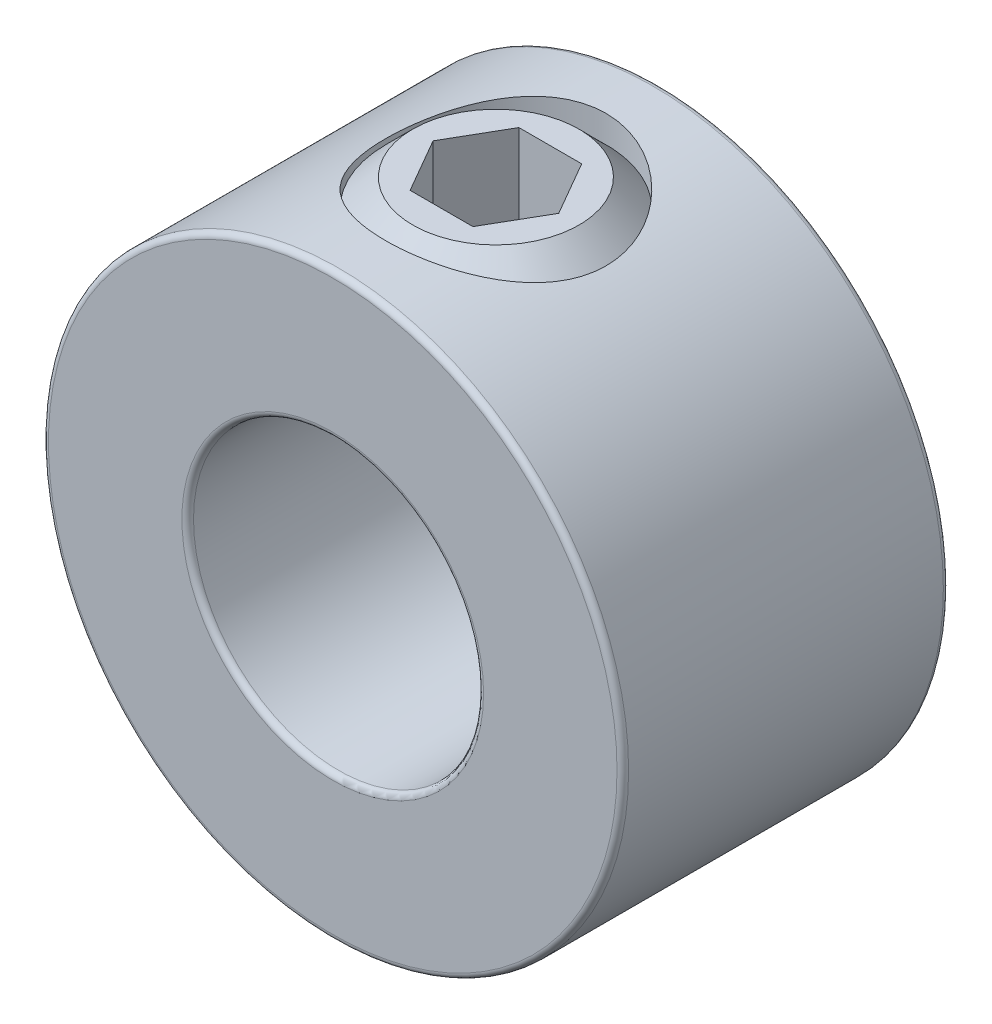
ISO-10303-21;
HEADER;
FILE_DESCRIPTION(('STEP AP214'),'2;1');
FILE_NAME('part.step','',(''),(''),'','','');
FILE_SCHEMA(('AUTOMOTIVE_DESIGN { 1 0 10303 214 1 1 1 1 }'));
ENDSEC;
DATA;
#1=APPLICATION_CONTEXT('core data for automotive mechanical design processes');
#2=APPLICATION_PROTOCOL_DEFINITION('international standard','automotive_design',2000,#1);
#3=PRODUCT_CONTEXT('',#1,'mechanical');
#4=PRODUCT('Part','Part','',(#3));
#5=PRODUCT_RELATED_PRODUCT_CATEGORY('part','',(#4));
#6=PRODUCT_DEFINITION_FORMATION('','',#4);
#7=PRODUCT_DEFINITION_CONTEXT('part definition',#1,'design');
#8=PRODUCT_DEFINITION('design','',#6,#7);
#9=PRODUCT_DEFINITION_SHAPE('','',#8);
#10=(LENGTH_UNIT() NAMED_UNIT(*) SI_UNIT(.MILLI.,.METRE.));
#11=(NAMED_UNIT(*) PLANE_ANGLE_UNIT() SI_UNIT($,.RADIAN.));
#12=(NAMED_UNIT(*) SI_UNIT($,.STERADIAN.) SOLID_ANGLE_UNIT());
#13=UNCERTAINTY_MEASURE_WITH_UNIT(LENGTH_MEASURE(1.E-05),#10,'distance_accuracy_value','');
#14=(GEOMETRIC_REPRESENTATION_CONTEXT(3) GLOBAL_UNCERTAINTY_ASSIGNED_CONTEXT((#13)) GLOBAL_UNIT_ASSIGNED_CONTEXT((#10,
#11,#12)) REPRESENTATION_CONTEXT('',''));
#15=CARTESIAN_POINT('',(0.,0.,0.));
#16=DIRECTION('',(0.,0.,1.));
#17=DIRECTION('',(1.,0.,0.));
#18=AXIS2_PLACEMENT_3D('',#15,#16,#17);
#19=CARTESIAN_POINT('',(0.,6.35,0.));
#20=DIRECTION('',(0.,1.,0.));
#21=DIRECTION('',(-1.,0.,0.));
#22=AXIS2_PLACEMENT_3D('',#19,#20,#21);
#23=PLANE('',#22);
#24=CARTESIAN_POINT('',(0.,6.35,0.));
#25=DIRECTION('',(0.,1.,0.));
#26=DIRECTION('',(-1.,0.,0.));
#27=AXIS2_PLACEMENT_3D('',#24,#25,#26);
#28=CIRCLE('',#27,1.81975161629017);
#29=CARTESIAN_POINT('',(-1.81975161629017,6.35,0.));
#30=VERTEX_POINT('',#29);
#31=EDGE_CURVE('E12',#30,#30,#28,.T.);
#32=ORIENTED_EDGE('',*,*,#31,.T.);
#33=EDGE_LOOP('',(#32));
#34=FACE_BOUND('',#33,.T.);
#35=DIRECTION('',(1.,0.,0.));
#36=VECTOR('',#35,1.);
#37=CARTESIAN_POINT('',(-0.687407664253899,6.34999999999999,-1.190625));
#38=LINE('',#37,#36);
#39=CARTESIAN_POINT('',(-0.687407664253899,6.34999999999999,-1.190625));
#40=VERTEX_POINT('',#39);
#41=CARTESIAN_POINT('',(0.687407664253899,6.35,-1.190625));
#42=VERTEX_POINT('',#41);
#43=EDGE_CURVE('E110',#40,#42,#38,.T.);
#44=ORIENTED_EDGE('',*,*,#43,.T.);
#45=DIRECTION('',(0.5,0.,0.866025403784439));
#46=VECTOR('',#45,1.);
#47=CARTESIAN_POINT('',(0.687407664253899,6.34999999999999,-1.190625));
#48=LINE('',#47,#46);
#49=CARTESIAN_POINT('',(1.3748153285078,6.34999999999999,0.));
#50=VERTEX_POINT('',#49);
#51=EDGE_CURVE('E56',#42,#50,#48,.T.);
#52=ORIENTED_EDGE('',*,*,#51,.T.);
#53=DIRECTION('',(-0.5,0.,0.866025403784439));
#54=VECTOR('',#53,1.);
#55=CARTESIAN_POINT('',(1.3748153285078,6.34999999999999,0.));
#56=LINE('',#55,#54);
#57=CARTESIAN_POINT('',(0.687407664253899,6.34999999999999,1.190625));
#58=VERTEX_POINT('',#57);
#59=EDGE_CURVE('E114',#50,#58,#56,.T.);
#60=ORIENTED_EDGE('',*,*,#59,.T.);
#61=DIRECTION('',(-1.,0.,0.));
#62=VECTOR('',#61,1.);
#63=CARTESIAN_POINT('',(0.687407664253899,6.34999999999999,1.190625));
#64=LINE('',#63,#62);
#65=CARTESIAN_POINT('',(-0.687407664253899,6.34999999999999,1.190625));
#66=VERTEX_POINT('',#65);
#67=EDGE_CURVE('E177',#58,#66,#64,.T.);
#68=ORIENTED_EDGE('',*,*,#67,.T.);
#69=DIRECTION('',(-0.5,0.,-0.866025403784439));
#70=VECTOR('',#69,1.);
#71=CARTESIAN_POINT('',(-0.687407664253899,6.34999999999999,1.190625));
#72=LINE('',#71,#70);
#73=CARTESIAN_POINT('',(-1.3748153285078,6.34999999999999,0.));
#74=VERTEX_POINT('',#73);
#75=EDGE_CURVE('E162',#66,#74,#72,.T.);
#76=ORIENTED_EDGE('',*,*,#75,.T.);
#77=DIRECTION('',(0.5,0.,-0.866025403784439));
#78=VECTOR('',#77,1.);
#79=CARTESIAN_POINT('',(-1.3748153285078,6.34999999999999,0.));
#80=LINE('',#79,#78);
#81=EDGE_CURVE('E158',#74,#40,#80,.T.);
#82=ORIENTED_EDGE('',*,*,#81,.T.);
#83=EDGE_LOOP('',(#44,#52,#60,#68,#76,#82));
#84=FACE_BOUND('',#83,.T.);
#85=ADVANCED_FACE('F42',(#34,#84),#23,.T.);
#86=CARTESIAN_POINT('',(0.,6.35,0.));
#87=DIRECTION('',(0.,-1.,0.));
#88=DIRECTION('',(1.,0.,0.));
#89=AXIS2_PLACEMENT_3D('',#86,#87,#88);
#90=CONICAL_SURFACE('',#89,1.81975161629017,0.785398163397449);
#91=CARTESIAN_POINT('',(0.,5.75675161629017,0.));
#92=DIRECTION('',(0.,1.,0.));
#93=DIRECTION('',(-1.,0.,0.));
#94=AXIS2_PLACEMENT_3D('',#91,#92,#93);
#95=CIRCLE('',#94,2.413);
#96=CARTESIAN_POINT('',(-2.413,5.75675161629017,0.));
#97=VERTEX_POINT('',#96);
#98=EDGE_CURVE('E49',#97,#97,#95,.T.);
#99=ORIENTED_EDGE('',*,*,#98,.T.);
#100=EDGE_LOOP('',(#99));
#101=FACE_BOUND('',#100,.T.);
#102=ORIENTED_EDGE('',*,*,#31,.F.);
#103=EDGE_LOOP('',(#102));
#104=FACE_BOUND('',#103,.T.);
#105=ADVANCED_FACE('F132',(#101,#104),#90,.T.);
#106=CARTESIAN_POINT('',(0.,3.175,0.));
#107=DIRECTION('',(0.,1.,0.));
#108=DIRECTION('',(-1.,0.,0.));
#109=AXIS2_PLACEMENT_3D('',#106,#107,#108);
#110=CYLINDRICAL_SURFACE('',#109,2.413);
#111=CARTESIAN_POINT('',(0.,3.76824838370983,0.));
#112=DIRECTION('',(0.,1.,0.));
#113=DIRECTION('',(-1.,0.,0.));
#114=AXIS2_PLACEMENT_3D('',#111,#112,#113);
#115=CIRCLE('',#114,2.413);
#116=CARTESIAN_POINT('',(-2.413,3.76824838370983,0.));
#117=VERTEX_POINT('',#116);
#118=EDGE_CURVE('E127',#117,#117,#115,.T.);
#119=ORIENTED_EDGE('',*,*,#118,.T.);
#120=EDGE_LOOP('',(#119));
#121=FACE_BOUND('',#120,.T.);
#122=ORIENTED_EDGE('',*,*,#98,.F.);
#123=EDGE_LOOP('',(#122));
#124=FACE_BOUND('',#123,.T.);
#125=ADVANCED_FACE('F135',(#121,#124),#110,.T.);
#126=CARTESIAN_POINT('',(0.,3.76824838370983,0.));
#127=DIRECTION('',(0.,1.,0.));
#128=DIRECTION('',(-1.,0.,0.));
#129=AXIS2_PLACEMENT_3D('',#126,#127,#128);
#130=CONICAL_SURFACE('',#129,2.413,0.785398163397448);
#131=CARTESIAN_POINT('',(0.,3.175,0.));
#132=DIRECTION('',(0.,1.,0.));
#133=DIRECTION('',(-1.,0.,0.));
#134=AXIS2_PLACEMENT_3D('',#131,#132,#133);
#135=CIRCLE('',#134,1.81975161629017);
#136=CARTESIAN_POINT('',(-1.81975161629017,3.175,0.));
#137=VERTEX_POINT('',#136);
#138=EDGE_CURVE('E119',#137,#137,#135,.T.);
#139=ORIENTED_EDGE('',*,*,#138,.T.);
#140=EDGE_LOOP('',(#139));
#141=FACE_BOUND('',#140,.T.);
#142=ORIENTED_EDGE('',*,*,#118,.F.);
#143=EDGE_LOOP('',(#142));
#144=FACE_BOUND('',#143,.T.);
#145=ADVANCED_FACE('F137',(#141,#144),#130,.T.);
#146=CARTESIAN_POINT('',(-1.81975161629017,3.175,0.));
#147=DIRECTION('',(0.,-1.,0.));
#148=DIRECTION('',(1.,0.,0.));
#149=AXIS2_PLACEMENT_3D('',#146,#147,#148);
#150=PLANE('',#149);
#151=CARTESIAN_POINT('',(0.,3.175,0.));
#152=DIRECTION('',(0.,1.,0.));
#153=DIRECTION('',(-1.,0.,0.));
#154=AXIS2_PLACEMENT_3D('',#151,#152,#153);
#155=CIRCLE('',#154,0.711898060451796);
#156=CARTESIAN_POINT('',(-0.711898060451796,3.175,0.));
#157=VERTEX_POINT('',#156);
#158=EDGE_CURVE('E115',#157,#157,#155,.T.);
#159=ORIENTED_EDGE('',*,*,#158,.T.);
#160=EDGE_LOOP('',(#159));
#161=FACE_BOUND('',#160,.T.);
#162=ORIENTED_EDGE('',*,*,#138,.F.);
#163=EDGE_LOOP('',(#162));
#164=FACE_BOUND('',#163,.T.);
#165=ADVANCED_FACE('F144',(#161,#164),#150,.T.);
#166=CARTESIAN_POINT('',(0.,3.175,0.));
#167=DIRECTION('',(0.,-1.,0.));
#168=DIRECTION('',(1.,0.,0.));
#169=AXIS2_PLACEMENT_3D('',#166,#167,#168);
#170=CONICAL_SURFACE('',#169,0.711898060451796,0.785398163397448);
#171=CARTESIAN_POINT('',(0.,3.8868980604518,0.));
#172=VERTEX_POINT('',#171);
#173=VERTEX_LOOP('',#172);
#174=FACE_BOUND('',#173,.T.);
#175=ORIENTED_EDGE('',*,*,#158,.F.);
#176=EDGE_LOOP('',(#175));
#177=FACE_BOUND('',#176,.T.);
#178=ADVANCED_FACE('F211',(#174,#177),#170,.F.);
#179=CARTESIAN_POINT('',(0.687407664253899,3.96874999999999,-1.190625));
#180=DIRECTION('',(-0.866025403784439,0.,0.5));
#181=DIRECTION('',(0.5,0.,0.866025403784438));
#182=AXIS2_PLACEMENT_3D('',#179,#180,#181);
#183=PLANE('',#182);
#184=ORIENTED_EDGE('',*,*,#51,.F.);
#185=DIRECTION('',(0.,1.,0.));
#186=VECTOR('',#185,1.);
#187=CARTESIAN_POINT('',(0.687407664253899,3.96874999999999,-1.190625));
#188=LINE('',#187,#186);
#189=CARTESIAN_POINT('',(0.687407664253899,3.96874999999999,-1.190625));
#190=VERTEX_POINT('',#189);
#191=EDGE_CURVE('E109',#190,#42,#188,.T.);
#192=ORIENTED_EDGE('',*,*,#191,.F.);
#193=DIRECTION('',(0.5,0.,0.866025403784439));
#194=VECTOR('',#193,1.);
#195=CARTESIAN_POINT('',(0.687407664253899,3.96874999999999,-1.190625));
#196=LINE('',#195,#194);
#197=CARTESIAN_POINT('',(1.3748153285078,3.96874999999999,0.));
#198=VERTEX_POINT('',#197);
#199=EDGE_CURVE('E100',#190,#198,#196,.T.);
#200=ORIENTED_EDGE('',*,*,#199,.T.);
#201=DIRECTION('',(0.,1.,0.));
#202=VECTOR('',#201,1.);
#203=CARTESIAN_POINT('',(1.3748153285078,3.96874999999999,0.));
#204=LINE('',#203,#202);
#205=EDGE_CURVE('E108',#198,#50,#204,.T.);
#206=ORIENTED_EDGE('',*,*,#205,.T.);
#207=EDGE_LOOP('',(#184,#192,#200,#206));
#208=FACE_BOUND('',#207,.T.);
#209=ADVANCED_FACE('F107',(#208),#183,.T.);
#210=CARTESIAN_POINT('',(1.3748153285078,3.96874999999999,0.));
#211=DIRECTION('',(-0.866025403784439,0.,-0.5));
#212=DIRECTION('',(-0.5,0.,0.866025403784439));
#213=AXIS2_PLACEMENT_3D('',#210,#211,#212);
#214=PLANE('',#213);
#215=ORIENTED_EDGE('',*,*,#59,.F.);
#216=ORIENTED_EDGE('',*,*,#205,.F.);
#217=DIRECTION('',(-0.5,0.,0.866025403784439));
#218=VECTOR('',#217,1.);
#219=CARTESIAN_POINT('',(1.3748153285078,3.96874999999999,0.));
#220=LINE('',#219,#218);
#221=CARTESIAN_POINT('',(0.687407664253899,3.96874999999999,1.190625));
#222=VERTEX_POINT('',#221);
#223=EDGE_CURVE('E96',#198,#222,#220,.T.);
#224=ORIENTED_EDGE('',*,*,#223,.T.);
#225=DIRECTION('',(0.,1.,0.));
#226=VECTOR('',#225,1.);
#227=CARTESIAN_POINT('',(0.687407664253899,3.96874999999999,1.190625));
#228=LINE('',#227,#226);
#229=EDGE_CURVE('E116',#222,#58,#228,.T.);
#230=ORIENTED_EDGE('',*,*,#229,.T.);
#231=EDGE_LOOP('',(#215,#216,#224,#230));
#232=FACE_BOUND('',#231,.T.);
#233=ADVANCED_FACE('F112',(#232),#214,.T.);
#234=CARTESIAN_POINT('',(0.687407664253899,3.96874999999999,1.190625));
#235=DIRECTION('',(0.,0.,-1.));
#236=DIRECTION('',(-1.,0.,0.));
#237=AXIS2_PLACEMENT_3D('',#234,#235,#236);
#238=PLANE('',#237);
#239=ORIENTED_EDGE('',*,*,#67,.F.);
#240=ORIENTED_EDGE('',*,*,#229,.F.);
#241=DIRECTION('',(-1.,0.,0.));
#242=VECTOR('',#241,1.);
#243=CARTESIAN_POINT('',(0.687407664253899,3.96874999999999,1.190625));
#244=LINE('',#243,#242);
#245=CARTESIAN_POINT('',(-0.687407664253899,3.96874999999999,1.190625));
#246=VERTEX_POINT('',#245);
#247=EDGE_CURVE('E102',#222,#246,#244,.T.);
#248=ORIENTED_EDGE('',*,*,#247,.T.);
#249=DIRECTION('',(0.,1.,0.));
#250=VECTOR('',#249,1.);
#251=CARTESIAN_POINT('',(-0.687407664253899,3.96874999999999,1.190625));
#252=LINE('',#251,#250);
#253=EDGE_CURVE('E121',#246,#66,#252,.T.);
#254=ORIENTED_EDGE('',*,*,#253,.T.);
#255=EDGE_LOOP('',(#239,#240,#248,#254));
#256=FACE_BOUND('',#255,.T.);
#257=ADVANCED_FACE('F175',(#256),#238,.T.);
#258=CARTESIAN_POINT('',(-0.687407664253899,3.96874999999999,1.190625));
#259=DIRECTION('',(0.866025403784439,0.,-0.5));
#260=DIRECTION('',(-0.5,0.,-0.866025403784438));
#261=AXIS2_PLACEMENT_3D('',#258,#259,#260);
#262=PLANE('',#261);
#263=ORIENTED_EDGE('',*,*,#75,.F.);
#264=ORIENTED_EDGE('',*,*,#253,.F.);
#265=DIRECTION('',(-0.5,0.,-0.866025403784439));
#266=VECTOR('',#265,1.);
#267=CARTESIAN_POINT('',(-0.687407664253899,3.96874999999999,1.190625));
#268=LINE('',#267,#266);
#269=CARTESIAN_POINT('',(-1.3748153285078,3.96874999999999,0.));
#270=VERTEX_POINT('',#269);
#271=EDGE_CURVE('E188',#246,#270,#268,.T.);
#272=ORIENTED_EDGE('',*,*,#271,.T.);
#273=DIRECTION('',(0.,1.,0.));
#274=VECTOR('',#273,1.);
#275=CARTESIAN_POINT('',(-1.3748153285078,3.96874999999999,0.));
#276=LINE('',#275,#274);
#277=EDGE_CURVE('E170',#270,#74,#276,.T.);
#278=ORIENTED_EDGE('',*,*,#277,.T.);
#279=EDGE_LOOP('',(#263,#264,#272,#278));
#280=FACE_BOUND('',#279,.T.);
#281=ADVANCED_FACE('F179',(#280),#262,.T.);
#282=CARTESIAN_POINT('',(-1.3748153285078,3.96874999999999,0.));
#283=DIRECTION('',(0.866025403784439,0.,0.5));
#284=DIRECTION('',(0.5,0.,-0.866025403784439));
#285=AXIS2_PLACEMENT_3D('',#282,#283,#284);
#286=PLANE('',#285);
#287=ORIENTED_EDGE('',*,*,#81,.F.);
#288=ORIENTED_EDGE('',*,*,#277,.F.);
#289=DIRECTION('',(0.5,0.,-0.866025403784439));
#290=VECTOR('',#289,1.);
#291=CARTESIAN_POINT('',(-1.3748153285078,3.96874999999999,0.));
#292=LINE('',#291,#290);
#293=CARTESIAN_POINT('',(-0.687407664253899,3.96874999999999,-1.190625));
#294=VERTEX_POINT('',#293);
#295=EDGE_CURVE('E186',#270,#294,#292,.T.);
#296=ORIENTED_EDGE('',*,*,#295,.T.);
#297=DIRECTION('',(0.,1.,0.));
#298=VECTOR('',#297,1.);
#299=CARTESIAN_POINT('',(-0.687407664253899,3.96874999999999,-1.190625));
#300=LINE('',#299,#298);
#301=EDGE_CURVE('E167',#294,#40,#300,.T.);
#302=ORIENTED_EDGE('',*,*,#301,.T.);
#303=EDGE_LOOP('',(#287,#288,#296,#302));
#304=FACE_BOUND('',#303,.T.);
#305=ADVANCED_FACE('F192',(#304),#286,.T.);
#306=CARTESIAN_POINT('',(-0.687407664253899,3.96874999999999,-1.190625));
#307=DIRECTION('',(0.,0.,1.));
#308=DIRECTION('',(1.,0.,0.));
#309=AXIS2_PLACEMENT_3D('',#306,#307,#308);
#310=PLANE('',#309);
#311=ORIENTED_EDGE('',*,*,#43,.F.);
#312=ORIENTED_EDGE('',*,*,#301,.F.);
#313=DIRECTION('',(1.,0.,0.));
#314=VECTOR('',#313,1.);
#315=CARTESIAN_POINT('',(-0.687407664253899,3.96874999999999,-1.190625));
#316=LINE('',#315,#314);
#317=EDGE_CURVE('E168',#294,#190,#316,.T.);
#318=ORIENTED_EDGE('',*,*,#317,.T.);
#319=ORIENTED_EDGE('',*,*,#191,.T.);
#320=EDGE_LOOP('',(#311,#312,#318,#319));
#321=FACE_BOUND('',#320,.T.);
#322=ADVANCED_FACE('F193',(#321),#310,.T.);
#323=CARTESIAN_POINT('',(1.3748153285078,3.96874999999999,0.));
#324=DIRECTION('',(0.,-1.,0.));
#325=DIRECTION('',(0.,0.,-1.));
#326=AXIS2_PLACEMENT_3D('',#323,#324,#325);
#327=PLANE('',#326);
#328=ORIENTED_EDGE('',*,*,#199,.F.);
#329=ORIENTED_EDGE('',*,*,#317,.F.);
#330=ORIENTED_EDGE('',*,*,#295,.F.);
#331=ORIENTED_EDGE('',*,*,#271,.F.);
#332=ORIENTED_EDGE('',*,*,#247,.F.);
#333=ORIENTED_EDGE('',*,*,#223,.F.);
#334=EDGE_LOOP('',(#328,#329,#330,#331,#332,#333));
#335=FACE_BOUND('',#334,.T.);
#336=ADVANCED_FACE('F98',(#335),#327,.F.);
#337=CLOSED_SHELL('',(#85,#105,#125,#145,#165,#178,#209,#233,#257,#281,#305,#322,#336));
#338=MANIFOLD_SOLID_BREP('B2',#337);
#339=CARTESIAN_POINT('',(0.,0.,3.571875));
#340=DIRECTION('',(0.,0.,1.));
#341=DIRECTION('',(1.,0.,0.));
#342=AXIS2_PLACEMENT_3D('',#339,#340,#341);
#343=PLANE('',#342);
#344=CARTESIAN_POINT('',(0.,0.,3.571875));
#345=DIRECTION('',(0.,0.,1.));
#346=DIRECTION('',(1.,0.,0.));
#347=AXIS2_PLACEMENT_3D('',#344,#345,#346);
#348=CIRCLE('',#347,3.302);
#349=CARTESIAN_POINT('',(3.302,0.,3.571875));
#350=VERTEX_POINT('',#349);
#351=EDGE_CURVE('E307',#350,#350,#348,.F.);
#352=ORIENTED_EDGE('',*,*,#351,.T.);
#353=EDGE_LOOP('',(#352));
#354=FACE_BOUND('',#353,.T.);
#355=CARTESIAN_POINT('',(0.,0.,3.571875));
#356=DIRECTION('',(0.,0.,1.));
#357=DIRECTION('',(1.,0.,0.));
#358=AXIS2_PLACEMENT_3D('',#355,#356,#357);
#359=CIRCLE('',#358,6.223);
#360=CARTESIAN_POINT('',(6.223,0.,3.571875));
#361=VERTEX_POINT('',#360);
#362=EDGE_CURVE('E311',#361,#361,#359,.T.);
#363=ORIENTED_EDGE('',*,*,#362,.T.);
#364=EDGE_LOOP('',(#363));
#365=FACE_BOUND('',#364,.T.);
#366=ADVANCED_FACE('F296',(#354,#365),#343,.T.);
#367=CARTESIAN_POINT('',(0.,0.,-3.571875));
#368=DIRECTION('',(0.,0.,1.));
#369=DIRECTION('',(1.,0.,0.));
#370=AXIS2_PLACEMENT_3D('',#367,#368,#369);
#371=PLANE('',#370);
#372=CARTESIAN_POINT('',(0.,0.,-3.571875));
#373=DIRECTION('',(0.,0.,1.));
#374=DIRECTION('',(1.,0.,0.));
#375=AXIS2_PLACEMENT_3D('',#372,#373,#374);
#376=CIRCLE('',#375,3.302);
#377=CARTESIAN_POINT('',(3.302,0.,-3.571875));
#378=VERTEX_POINT('',#377);
#379=EDGE_CURVE('E322',#378,#378,#376,.T.);
#380=ORIENTED_EDGE('',*,*,#379,.T.);
#381=EDGE_LOOP('',(#380));
#382=FACE_BOUND('',#381,.T.);
#383=CARTESIAN_POINT('',(0.,0.,-3.571875));
#384=DIRECTION('',(0.,0.,1.));
#385=DIRECTION('',(1.,0.,0.));
#386=AXIS2_PLACEMENT_3D('',#383,#384,#385);
#387=CIRCLE('',#386,6.223);
#388=CARTESIAN_POINT('',(6.223,0.,-3.571875));
#389=VERTEX_POINT('',#388);
#390=EDGE_CURVE('E325',#389,#389,#387,.F.);
#391=ORIENTED_EDGE('',*,*,#390,.T.);
#392=EDGE_LOOP('',(#391));
#393=FACE_BOUND('',#392,.T.);
#394=ADVANCED_FACE('F361',(#382,#393),#371,.F.);
#395=CARTESIAN_POINT('',(0.,0.,3.571875));
#396=DIRECTION('',(0.,0.,-1.));
#397=DIRECTION('',(-1.,0.,0.));
#398=AXIS2_PLACEMENT_3D('',#395,#396,#397);
#399=CYLINDRICAL_SURFACE('',#398,6.35);
#400=CARTESIAN_POINT('',(0.,0.,-3.444875));
#401=DIRECTION('',(0.,0.,1.));
#402=DIRECTION('',(1.,0.,0.));
#403=AXIS2_PLACEMENT_3D('',#400,#401,#402);
#404=CIRCLE('',#403,6.35);
#405=CARTESIAN_POINT('',(6.35,0.,-3.444875));
#406=VERTEX_POINT('',#405);
#407=EDGE_CURVE('E41',#406,#406,#404,.T.);
#408=ORIENTED_EDGE('',*,*,#407,.T.);
#409=EDGE_LOOP('',(#408));
#410=FACE_BOUND('',#409,.T.);
#411=CARTESIAN_POINT('',(0.,0.,3.444875));
#412=DIRECTION('',(0.,0.,1.));
#413=DIRECTION('',(1.,0.,0.));
#414=AXIS2_PLACEMENT_3D('',#411,#412,#413);
#415=CIRCLE('',#414,6.35);
#416=CARTESIAN_POINT('',(6.35,0.,3.444875));
#417=VERTEX_POINT('',#416);
#418=EDGE_CURVE('E303',#417,#417,#415,.F.);
#419=ORIENTED_EDGE('',*,*,#418,.T.);
#420=EDGE_LOOP('',(#419));
#421=FACE_BOUND('',#420,.T.);
#422=CARTESIAN_POINT('',(0.,6.35,-2.413));
#423=CARTESIAN_POINT('',(0.130555931467962,6.35000398969011,-2.41300527534602));
#424=CARTESIAN_POINT('',(0.261076241377739,6.34593890816647,-2.4023714543113));
#425=CARTESIAN_POINT('',(0.518209446534913,6.33012963929965,-2.36029479676423));
#426=CARTESIAN_POINT('',(0.644823015088655,6.31838678300935,-2.32885556715778));
#427=CARTESIAN_POINT('',(0.890396734122701,6.28848040494,-2.24644511602075));
#428=CARTESIAN_POINT('',(1.00937135935963,6.27032947705095,-2.19551218938446));
#429=CARTESIAN_POINT('',(1.23707694907279,6.22940932060409,-2.07575764561934));
#430=CARTESIAN_POINT('',(1.34580507871092,6.20663881943741,-2.00693109764769));
#431=CARTESIAN_POINT('',(1.5546544090621,6.15771932779737,-1.85022277092613));
#432=CARTESIAN_POINT('',(1.65427192875035,6.13147296383124,-1.76170041624995));
#433=CARTESIAN_POINT('',(1.83765571561736,6.07903240405007,-1.56947315042905));
#434=CARTESIAN_POINT('',(1.92141693988139,6.05283822744466,-1.46576342765122));
#435=CARTESIAN_POINT('',(2.07395660623911,6.00232668170519,-1.24113386470124));
#436=CARTESIAN_POINT('',(2.14201618015845,5.97812365120729,-1.11969756154783));
#437=CARTESIAN_POINT('',(2.25652093858858,5.93585432476053,-0.866038380432351));
#438=CARTESIAN_POINT('',(2.30297502037546,5.91778550353544,-0.733819969020803));
#439=CARTESIAN_POINT('',(2.37094947712185,5.89087364983883,-0.46815363189803));
#440=CARTESIAN_POINT('',(2.39343294050412,5.88167580744491,-0.334989300795486));
#441=CARTESIAN_POINT('',(2.41583880524757,5.87251090464605,-0.0664845962936197));
#442=CARTESIAN_POINT('',(2.41577084821779,5.87253989940926,0.0688548224232351));
#443=CARTESIAN_POINT('',(2.39381090108878,5.88152011871453,0.328972227003014));
#444=CARTESIAN_POINT('',(2.37326609797153,5.88992057372023,0.453886522563246));
#445=CARTESIAN_POINT('',(2.31316652422954,5.91378008823147,0.698339704990829));
#446=CARTESIAN_POINT('',(2.27360881167116,5.92924024008996,0.817877756841903));
#447=CARTESIAN_POINT('',(2.17588364092748,5.96580146890692,1.0508916152852));
#448=CARTESIAN_POINT('',(2.11737290423754,5.98700531598431,1.16420661484106));
#449=CARTESIAN_POINT('',(1.98364217411328,6.03263175509447,1.37979639920587));
#450=CARTESIAN_POINT('',(1.90841630395244,6.05705547794376,1.4820672822727));
#451=CARTESIAN_POINT('',(1.73726689770536,6.10842961274997,1.68010694238863));
#452=CARTESIAN_POINT('',(1.64027173491613,6.13543795015635,1.77493688260015));
#453=CARTESIAN_POINT('',(1.43144868882472,6.18748920351012,1.94726806056401));
#454=CARTESIAN_POINT('',(1.31961840653187,6.2125318005324,2.02476649017818));
#455=CARTESIAN_POINT('',(1.08185265975391,6.25835188225341,2.16130771487283));
#456=CARTESIAN_POINT('',(0.955717417234618,6.27905339803369,2.22002994310971));
#457=CARTESIAN_POINT('',(0.694375189035109,6.31329326294077,2.31510736575226));
#458=CARTESIAN_POINT('',(0.559172376611221,6.32683488218724,2.3514727723643));
#459=CARTESIAN_POINT('',(0.291428150212525,6.3446501972992,2.39898109857718));
#460=CARTESIAN_POINT('',(0.159141645079808,6.34938771868047,2.41138775288999));
#461=CARTESIAN_POINT('',(-0.105693065348276,6.35049981057155,2.41431626348443));
#462=CARTESIAN_POINT('',(-0.238241203822052,6.34687629478166,2.40484312768025));
#463=CARTESIAN_POINT('',(-0.494323602805378,6.33197908606406,2.36523562382545));
#464=CARTESIAN_POINT('',(-0.61800684441211,6.32101461634214,2.33593589818825));
#465=CARTESIAN_POINT('',(-0.858609565436108,6.29285092848222,2.25861304376362));
#466=CARTESIAN_POINT('',(-0.975528163914414,6.27565090041604,2.21058748264173));
#467=CARTESIAN_POINT('',(-1.20317276582384,6.23607457125026,2.09563503714011));
#468=CARTESIAN_POINT('',(-1.3136121499673,6.21355984396609,2.02818967610491));
#469=CARTESIAN_POINT('',(-1.52197988578177,6.16583504517286,1.87689595883598));
#470=CARTESIAN_POINT('',(-1.61990351002366,6.14062396176678,1.79304143465584));
#471=CARTESIAN_POINT('',(-1.80656807112922,6.08841217199752,1.60543272496061));
#472=CARTESIAN_POINT('',(-1.89441393314817,6.06139435477813,1.5007904098217));
#473=CARTESIAN_POINT('',(-2.05148411432654,6.01005496187559,1.27772800811267));
#474=CARTESIAN_POINT('',(-2.12070651399853,5.98573366426972,1.15930650314625));
#475=CARTESIAN_POINT('',(-2.23870023772464,5.94261798623815,0.910922748538602));
#476=CARTESIAN_POINT('',(-2.28736466342468,5.92385264334907,0.780904332023381));
#477=CARTESIAN_POINT('',(-2.36177800946808,5.89458517077402,0.513602694331982));
#478=CARTESIAN_POINT('',(-2.38754162954713,5.8840777409413,0.376324193363579));
#479=CARTESIAN_POINT('',(-2.41408994040532,5.87323215610138,0.108127165215383));
#480=CARTESIAN_POINT('',(-2.41640623148607,5.87227054588007,-0.0226157343841075));
#481=CARTESIAN_POINT('',(-2.3999373204655,5.8790202253426,-0.282524873396556));
#482=CARTESIAN_POINT('',(-2.38115423316032,5.88673064582666,-0.41169126951125));
#483=CARTESIAN_POINT('',(-2.32422421188573,5.90943043237583,-0.660552265849344));
#484=CARTESIAN_POINT('',(-2.28672002796391,5.92417751295514,-0.780417919491674));
#485=CARTESIAN_POINT('',(-2.19398528189399,5.95914188552999,-1.01222145618602));
#486=CARTESIAN_POINT('',(-2.13875018285588,5.97936057736356,-1.12415730124382));
#487=CARTESIAN_POINT('',(-2.00869997639504,6.02433337271119,-1.34342800575803));
#488=CARTESIAN_POINT('',(-1.93299650808671,6.04927206356278,-1.4501976241717));
#489=CARTESIAN_POINT('',(-1.76551836882645,6.10025417003155,-1.65000619367226));
#490=CARTESIAN_POINT('',(-1.67373852090438,6.12629793945648,-1.74304070389426));
#491=CARTESIAN_POINT('',(-1.47055494697206,6.17831294001547,-1.91807209951937));
#492=CARTESIAN_POINT('',(-1.35833856072122,6.20419794006484,-1.99915556641372));
#493=CARTESIAN_POINT('',(-1.12096041375387,6.25144642675378,-2.14129762074769));
#494=CARTESIAN_POINT('',(-0.995797050693124,6.27280935273315,-2.20235372565052));
#495=CARTESIAN_POINT('',(-0.728778395788011,6.30955475572144,-2.30499263616226));
#496=CARTESIAN_POINT('',(-0.58638469778337,6.32454657619379,-2.3453288052365));
#497=CARTESIAN_POINT('',(-0.295976705251577,6.34476431329028,-2.39932232882264));
#498=CARTESIAN_POINT('',(-0.147965475024477,6.34999547828747,-2.41299402119021));
#499=CARTESIAN_POINT('',(0.,6.35,-2.413));
#500=B_SPLINE_CURVE_WITH_KNOTS('',3,(#422,#423,#424,#425,#426,#427,#428,#429,#430,#431,#432,
#433,#434,#435,#436,#437,#438,#439,#440,#441,#442,#443,#444,#445,#446,#447,#448,#449,#450,#451,
#452,#453,#454,#455,#456,#457,#458,#459,#460,#461,#462,#463,#464,#465,#466,#467,#468,#469,#470,
#471,#472,#473,#474,#475,#476,#477,#478,#479,#480,#481,#482,#483,#484,#485,#486,#487,#488,#489,
#490,#491,#492,#493,#494,#495,#496,#497,#498,#499),.UNSPECIFIED.,.T.,.F.,(4,2,2,2,2,2,2,2,2,2,2,
2,2,2,2,2,2,2,2,2,2,2,2,2,2,2,2,2,2,2,2,2,2,2,2,2,2,2,4),(0.,0.391121887064184,
0.782175985486185,1.17246577830223,1.56286323524963,1.96854634212709,2.37435825594016,
2.79613130529395,3.21773051175688,3.62166628723491,4.02542936468621,4.40427313209371,
4.78317553819666,5.16936515238192,5.55569075901495,5.96873424705112,6.38184461005431,
6.80167192308661,7.22130732355892,7.61812936188612,8.01486058335588,8.39585156202364,
8.77689204483065,9.16923685274999,9.56172942118012,9.9776135359701,10.3935404987953,
10.8116043631128,11.2293996833676,11.6197130905881,12.0099873800853,12.3876994067832,
12.7655081575183,13.1635000328781,13.5616203073395,13.9821012344605,14.4026342635628,
14.8461505355472,15.2894282569131),.UNSPECIFIED.);
#501=CARTESIAN_POINT('',(0.,6.35,-2.413));
#502=VERTEX_POINT('',#501);
#503=EDGE_CURVE('E328',#502,#502,#500,.T.);
#504=ORIENTED_EDGE('',*,*,#503,.T.);
#505=EDGE_LOOP('',(#504));
#506=FACE_BOUND('',#505,.T.);
#507=ADVANCED_FACE('F357',(#410,#421,#506),#399,.T.);
#508=CARTESIAN_POINT('',(0.,0.,3.571875));
#509=DIRECTION('',(0.,0.,-1.));
#510=DIRECTION('',(-1.,0.,0.));
#511=AXIS2_PLACEMENT_3D('',#508,#509,#510);
#512=CYLINDRICAL_SURFACE('',#511,3.175);
#513=CARTESIAN_POINT('',(0.,0.,-3.444875));
#514=DIRECTION('',(0.,0.,1.));
#515=DIRECTION('',(1.,0.,0.));
#516=AXIS2_PLACEMENT_3D('',#513,#514,#515);
#517=CIRCLE('',#516,3.175);
#518=CARTESIAN_POINT('',(3.175,0.,-3.444875));
#519=VERTEX_POINT('',#518);
#520=EDGE_CURVE('E316',#519,#519,#517,.F.);
#521=ORIENTED_EDGE('',*,*,#520,.T.);
#522=EDGE_LOOP('',(#521));
#523=FACE_BOUND('',#522,.T.);
#524=CARTESIAN_POINT('',(0.,0.,3.444875));
#525=DIRECTION('',(0.,0.,1.));
#526=DIRECTION('',(1.,0.,0.));
#527=AXIS2_PLACEMENT_3D('',#524,#525,#526);
#528=CIRCLE('',#527,3.175);
#529=CARTESIAN_POINT('',(3.175,0.,3.444875));
#530=VERTEX_POINT('',#529);
#531=EDGE_CURVE('E319',#530,#530,#528,.T.);
#532=ORIENTED_EDGE('',*,*,#531,.T.);
#533=EDGE_LOOP('',(#532));
#534=FACE_BOUND('',#533,.T.);
#535=CARTESIAN_POINT('',(0.,3.175,-2.413));
#536=CARTESIAN_POINT('',(0.117443171605231,3.17499092904906,-2.41299058031907));
#537=CARTESIAN_POINT('',(0.23503818841931,3.16841692674332,-2.4043581847269));
#538=CARTESIAN_POINT('',(0.466484967913331,3.14271336140829,-2.37038175457781));
#539=CARTESIAN_POINT('',(0.580328596183407,3.12355818632314,-2.34500362950094));
#540=CARTESIAN_POINT('',(0.80033693546367,3.07452724978738,-2.27928432631256));
#541=CARTESIAN_POINT('',(0.906543039514099,3.04471549355359,-2.23903243487973));
#542=CARTESIAN_POINT('',(1.10997011785933,2.97659455342082,-2.14548015839209));
#543=CARTESIAN_POINT('',(1.20719255384311,2.93828675533249,-2.09218190121579));
#544=CARTESIAN_POINT('',(1.40022726688529,2.85170030734834,-1.96882085307546));
#545=CARTESIAN_POINT('',(1.49506365463583,2.80282512985173,-1.89765858122501));
#546=CARTESIAN_POINT('',(1.67223382567996,2.7008760546092,-1.7435641158176));
#547=CARTESIAN_POINT('',(1.75454859398162,2.64779595363648,-1.66061438438314));
#548=CARTESIAN_POINT('',(1.92203888294129,2.5296135351956,-1.46565859240837));
#549=CARTESIAN_POINT('',(2.00423140536036,2.4643124367144,-1.35120048467098));
#550=CARTESIAN_POINT('',(2.14857118710811,2.33951215894306,-1.10735736644856));
#551=CARTESIAN_POINT('',(2.21074385995913,2.28000569136514,-0.977991565717825));
#552=CARTESIAN_POINT('',(2.29462037317499,2.19490180220151,-0.752497308608559));
#553=CARTESIAN_POINT('',(2.32287346332998,2.16472241167552,-0.66055827907226));
#554=CARTESIAN_POINT('',(2.36849823013454,2.11470881226284,-0.47139038700259));
#555=CARTESIAN_POINT('',(2.38589523743028,2.09485053921884,-0.374174418255039));
#556=CARTESIAN_POINT('',(2.40870358471578,2.06860028206587,-0.175460476777278));
#557=CARTESIAN_POINT('',(2.4139959431512,2.06234200752845,-0.073929905731699));
#558=CARTESIAN_POINT('',(2.41169213967819,2.06503422028968,0.128798184800726));
#559=CARTESIAN_POINT('',(2.40409306334661,2.07398814667793,0.22999562379254));
#560=CARTESIAN_POINT('',(2.37836508518799,2.10340433920656,0.416917246134645));
#561=CARTESIAN_POINT('',(2.36156171265492,2.1224091464969,0.503073429560243));
#562=CARTESIAN_POINT('',(2.31942910669347,2.16837457604816,0.671064962974234));
#563=CARTESIAN_POINT('',(2.29409116468348,2.19534332114491,0.752895800354834));
#564=CARTESIAN_POINT('',(2.21702947004233,2.27376916611904,0.962631680289748));
#565=CARTESIAN_POINT('',(2.15880606368402,2.32983777456744,1.08642083974007));
#566=CARTESIAN_POINT('',(2.0240584670168,2.44783368287627,1.32063556736185));
#567=CARTESIAN_POINT('',(1.94748865288627,2.50977535205404,1.43102676980356));
#568=CARTESIAN_POINT('',(1.77457755480707,2.63500191833982,1.64086400526623));
#569=CARTESIAN_POINT('',(1.67772908569284,2.69827393808612,1.73990181478264));
#570=CARTESIAN_POINT('',(1.46641465679805,2.81868720555883,1.92133244794249));
#571=CARTESIAN_POINT('',(1.35198192561174,2.87583967861316,2.00375600179513));
#572=CARTESIAN_POINT('',(1.1302184691796,2.96897239724258,2.13504920976438));
#573=CARTESIAN_POINT('',(1.02573469648465,3.00691100546587,2.18732233798596));
#574=CARTESIAN_POINT('',(0.807524498934965,3.07269924184988,2.27691743542351));
#575=CARTESIAN_POINT('',(0.693803632023793,3.10055488265641,2.31424831636675));
#576=CARTESIAN_POINT('',(0.458986561176873,3.14392869528766,2.37204565582169));
#577=CARTESIAN_POINT('',(0.337846653718269,3.15936426972399,2.39239924216467));
#578=CARTESIAN_POINT('',(0.0929212408274502,3.17600778354888,2.41433718167044));
#579=CARTESIAN_POINT('',(-0.0308628412677098,3.17722319336241,2.41593138989231));
#580=CARTESIAN_POINT('',(-0.263113673769308,3.16598164725166,2.40112430213952));
#581=CARTESIAN_POINT('',(-0.371784896474092,3.15499411480433,2.38665711938384));
#582=CARTESIAN_POINT('',(-0.584657379974265,3.12256258934286,2.34361709819449));
#583=CARTESIAN_POINT('',(-0.688857782558675,3.10111659842469,2.31504156459624));
#584=CARTESIAN_POINT('',(-0.893151752270642,3.04866013703249,2.24429284461138));
#585=CARTESIAN_POINT('',(-0.993066473951875,3.01741404656932,2.20178337061745));
#586=CARTESIAN_POINT('',(-1.18427030490273,2.94762615076737,2.10512741976429));
#587=CARTESIAN_POINT('',(-1.27555811070553,2.90908324556455,2.05097918840424));
#588=CARTESIAN_POINT('',(-1.4629408219305,2.82008518778891,1.92283493337221));
#589=CARTESIAN_POINT('',(-1.55736336530955,2.76871323654288,1.84703979297132));
#590=CARTESIAN_POINT('',(-1.7330266340156,2.66229345480278,1.68334400808498));
#591=CARTESIAN_POINT('',(-1.81424018707203,2.60723836781931,1.59541908083344));
#592=CARTESIAN_POINT('',(-1.93310120506622,2.51929011373857,1.44596227809647));
#593=CARTESIAN_POINT('',(-1.97518148865632,2.48634042838264,1.38794003709871));
#594=CARTESIAN_POINT('',(-2.05424288960517,2.42143291492003,1.26799956797446));
#595=CARTESIAN_POINT('',(-2.09122218168265,2.38947544500995,1.2060799567393));
#596=CARTESIAN_POINT('',(-2.19405069763864,2.29677780916441,1.01470921513655));
#597=CARTESIAN_POINT('',(-2.25209423008379,2.2389759481709,0.879267670433414));
#598=CARTESIAN_POINT('',(-2.32600727289693,2.16148731453314,0.648667618119571));
#599=CARTESIAN_POINT('',(-2.34951337659766,2.13568591161393,0.557995127674168));
#600=CARTESIAN_POINT('',(-2.38597736286025,2.09487284834006,0.372275602812797));
#601=CARTESIAN_POINT('',(-2.39896041795918,2.0798354491901,0.277239585981548));
#602=CARTESIAN_POINT('',(-2.41347202601588,2.06298898322372,0.0843820043038626));
#603=CARTESIAN_POINT('',(-2.41491881071071,2.06127434940024,-0.0134545208329241));
#604=CARTESIAN_POINT('',(-2.40600289841214,2.07166816759277,-0.20788213648133));
#605=CARTESIAN_POINT('',(-2.39562846174622,2.08379036100337,-0.304471892411458));
#606=CARTESIAN_POINT('',(-2.36137219311358,2.12256830664758,-0.508834367656112));
#607=CARTESIAN_POINT('',(-2.33557340769404,2.15126142901359,-0.615881798172457));
#608=CARTESIAN_POINT('',(-2.27108364148613,2.21923176610734,-0.822515613730422));
#609=CARTESIAN_POINT('',(-2.2323592210675,2.25853638265596,-0.922081817130457));
#610=CARTESIAN_POINT('',(-2.12610942507655,2.35955877527054,-1.15053309693759));
#611=CARTESIAN_POINT('',(-2.05324191025264,2.42403799567888,-1.27569998264042));
#612=CARTESIAN_POINT('',(-1.88728411653423,2.55539518076956,-1.5104318596925));
#613=CARTESIAN_POINT('',(-1.79417076882036,2.62227580852244,-1.61997881541957));
#614=CARTESIAN_POINT('',(-1.58693666845894,2.75272337581287,-1.82362287315767));
#615=CARTESIAN_POINT('',(-1.47252844795802,2.81622750409905,-1.9174704362987));
#616=CARTESIAN_POINT('',(-1.22472214874906,2.93245405690648,-2.0844185884594));
#617=CARTESIAN_POINT('',(-1.09136873492959,2.9852011492147,-2.15756679766189));
#618=CARTESIAN_POINT('',(-0.848324156263042,3.06143310070406,-2.2616762509508));
#619=CARTESIAN_POINT('',(-0.742491250018576,3.08897584082985,-2.29871569194653));
#620=CARTESIAN_POINT('',(-0.524711420429954,3.13329848559572,-2.35794338327758));
#621=CARTESIAN_POINT('',(-0.412780537897338,3.1501052759874,-2.38016873825137));
#622=CARTESIAN_POINT('',(-0.249887399880881,3.16554486424948,-2.40054788675386));
#623=CARTESIAN_POINT('',(-0.200104041382905,3.16908209053624,-2.40520884201812));
#624=CARTESIAN_POINT('',(-0.10022305414221,3.17381185752955,-2.41143725628489));
#625=CARTESIAN_POINT('',(-0.0501253573366512,3.17500387152911,-2.41300402036888));
#626=CARTESIAN_POINT('',(0.,3.175,-2.413));
#627=B_SPLINE_CURVE_WITH_KNOTS('',3,(#535,#536,#537,#538,#539,#540,#541,#542,#543,#544,#545,
#546,#547,#548,#549,#550,#551,#552,#553,#554,#555,#556,#557,#558,#559,#560,#561,#562,#563,#564,
#565,#566,#567,#568,#569,#570,#571,#572,#573,#574,#575,#576,#577,#578,#579,#580,#581,#582,#583,
#584,#585,#586,#587,#588,#589,#590,#591,#592,#593,#594,#595,#596,#597,#598,#599,#600,#601,#602,
#603,#604,#605,#606,#607,#608,#609,#610,#611,#612,#613,#614,#615,#616,#617,#618,#619,#620,#621,
#622,#623,#624,#625,#626),.UNSPECIFIED.,.T.,.F.,(4,2,2,2,2,2,2,2,2,2,2,2,2,2,2,2,2,2,2,2,2,2,2,
2,2,2,2,2,2,2,2,2,2,2,2,2,2,2,2,2,2,2,2,2,2,4),(0.,0.352113770291782,0.704946585369681,
1.05569488379078,1.40638601280107,1.78976092813112,2.17371233600607,2.63773050853704,
3.10115730525324,3.40258553658297,3.70330778533679,4.00697348207613,4.31070783899934,
4.57916413533347,4.84789519559245,5.28900480236595,5.73122295780719,6.18621377116464,
6.64035513804427,7.00739894320242,7.37422351187941,7.74346787257931,8.11251824563582,
8.44151894934109,8.77058252746343,9.10825790412116,9.44598421987268,9.83917081589853,
10.2331562784928,10.469557715449,10.7060435254032,11.1774135342105,11.4679029980311,
11.757695504225,12.0495402292483,12.3416750384965,12.6811651199407,13.0215403855346,
13.4947220530831,13.9684457327182,14.4491015240246,14.9286423754468,15.2736416515379,
15.6177735325977,15.768023783139,15.9183077742625),.UNSPECIFIED.);
#628=CARTESIAN_POINT('',(0.,3.175,-2.413));
#629=VERTEX_POINT('',#628);
#630=EDGE_CURVE('E329',#629,#629,#627,.T.);
#631=ORIENTED_EDGE('',*,*,#630,.F.);
#632=EDGE_LOOP('',(#631));
#633=FACE_BOUND('',#632,.T.);
#634=ADVANCED_FACE('F341',(#523,#534,#633),#512,.F.);
#635=CARTESIAN_POINT('',(0.,6.35,0.));
#636=DIRECTION('',(0.,-1.,0.));
#637=DIRECTION('',(0.,0.,-1.));
#638=AXIS2_PLACEMENT_3D('',#635,#636,#637);
#639=CYLINDRICAL_SURFACE('',#638,2.413);
#640=ORIENTED_EDGE('',*,*,#630,.T.);
#641=EDGE_LOOP('',(#640));
#642=FACE_BOUND('',#641,.T.);
#643=ORIENTED_EDGE('',*,*,#503,.F.);
#644=EDGE_LOOP('',(#643));
#645=FACE_BOUND('',#644,.T.);
#646=ADVANCED_FACE('F344',(#642,#645),#639,.F.);
#647=CARTESIAN_POINT('',(0.,0.,-3.444875));
#648=DIRECTION('',(0.,0.,1.));
#649=DIRECTION('',(1.,0.,0.));
#650=AXIS2_PLACEMENT_3D('',#647,#648,#649);
#651=TOROIDAL_SURFACE('',#650,3.302,0.127);
#652=ORIENTED_EDGE('',*,*,#520,.F.);
#653=EDGE_LOOP('',(#652));
#654=FACE_BOUND('',#653,.T.);
#655=ORIENTED_EDGE('',*,*,#379,.F.);
#656=EDGE_LOOP('',(#655));
#657=FACE_BOUND('',#656,.T.);
#658=ADVANCED_FACE('F347',(#654,#657),#651,.T.);
#659=CARTESIAN_POINT('',(0.,0.,3.444875));
#660=DIRECTION('',(0.,0.,1.));
#661=DIRECTION('',(1.,0.,0.));
#662=AXIS2_PLACEMENT_3D('',#659,#660,#661);
#663=TOROIDAL_SURFACE('',#662,3.302,0.127);
#664=ORIENTED_EDGE('',*,*,#351,.F.);
#665=EDGE_LOOP('',(#664));
#666=FACE_BOUND('',#665,.T.);
#667=ORIENTED_EDGE('',*,*,#531,.F.);
#668=EDGE_LOOP('',(#667));
#669=FACE_BOUND('',#668,.T.);
#670=ADVANCED_FACE('F354',(#666,#669),#663,.T.);
#671=CARTESIAN_POINT('',(0.,0.,-3.444875));
#672=DIRECTION('',(0.,0.,1.));
#673=DIRECTION('',(1.,0.,0.));
#674=AXIS2_PLACEMENT_3D('',#671,#672,#673);
#675=TOROIDAL_SURFACE('',#674,6.223,0.127);
#676=ORIENTED_EDGE('',*,*,#390,.F.);
#677=EDGE_LOOP('',(#676));
#678=FACE_BOUND('',#677,.T.);
#679=ORIENTED_EDGE('',*,*,#407,.F.);
#680=EDGE_LOOP('',(#679));
#681=FACE_BOUND('',#680,.T.);
#682=ADVANCED_FACE('F373',(#678,#681),#675,.T.);
#683=CARTESIAN_POINT('',(0.,0.,3.444875));
#684=DIRECTION('',(0.,0.,1.));
#685=DIRECTION('',(1.,0.,0.));
#686=AXIS2_PLACEMENT_3D('',#683,#684,#685);
#687=TOROIDAL_SURFACE('',#686,6.223,0.127);
#688=ORIENTED_EDGE('',*,*,#418,.F.);
#689=EDGE_LOOP('',(#688));
#690=FACE_BOUND('',#689,.T.);
#691=ORIENTED_EDGE('',*,*,#362,.F.);
#692=EDGE_LOOP('',(#691));
#693=FACE_BOUND('',#692,.T.);
#694=ADVANCED_FACE('F298',(#690,#693),#687,.T.);
#695=CLOSED_SHELL('',(#366,#394,#507,#634,#646,#658,#670,#682,#694));
#696=MANIFOLD_SOLID_BREP('B6',#695);
#697=ADVANCED_BREP_SHAPE_REPRESENTATION('',(#18,#338,#696),#14);
#698=SHAPE_DEFINITION_REPRESENTATION(#9,#697);
ENDSEC;
END-ISO-10303-21;
